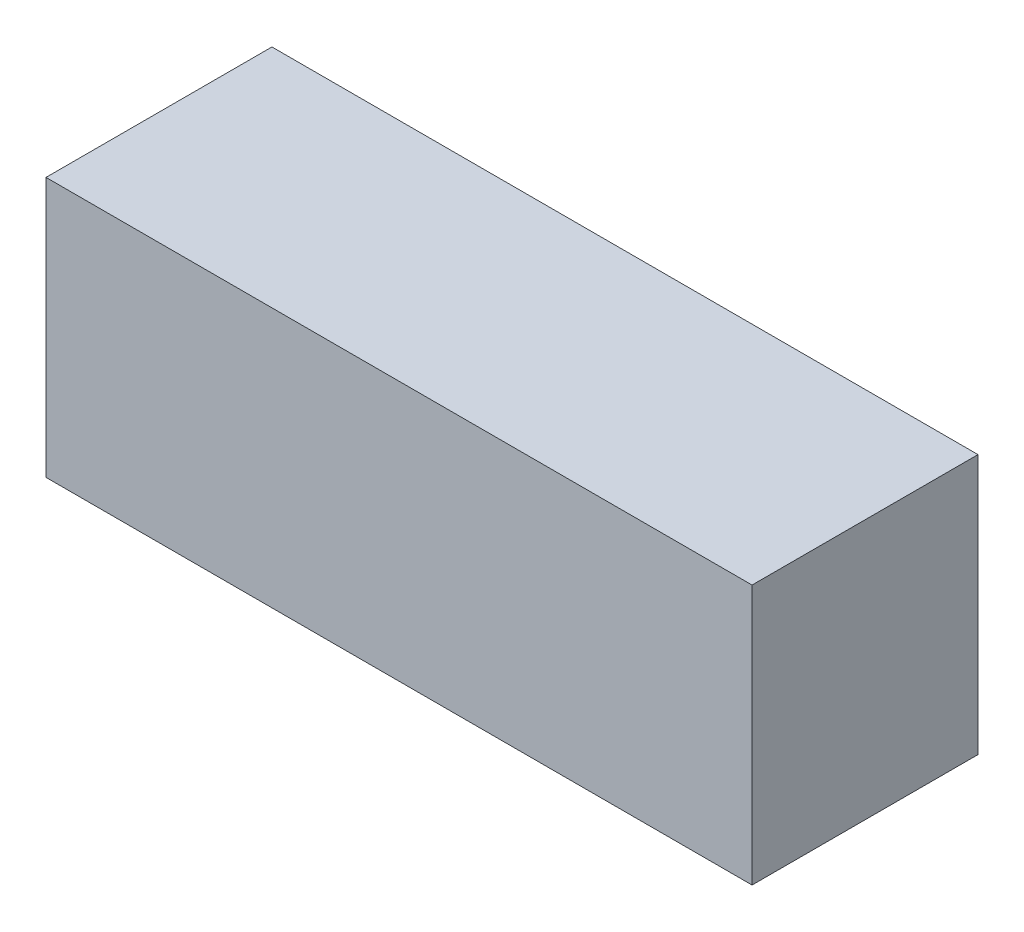
ISO-10303-21;
HEADER;
FILE_DESCRIPTION(('STEP AP214'),'2;1');
FILE_NAME('part.step','',(''),(''),'','','');
FILE_SCHEMA(('AUTOMOTIVE_DESIGN { 1 0 10303 214 1 1 1 1 }'));
ENDSEC;
DATA;
#1=APPLICATION_CONTEXT('core data for automotive mechanical design processes');
#2=APPLICATION_PROTOCOL_DEFINITION('international standard','automotive_design',2000,#1);
#3=PRODUCT_CONTEXT('',#1,'mechanical');
#4=PRODUCT('Part','Part','',(#3));
#5=PRODUCT_RELATED_PRODUCT_CATEGORY('part','',(#4));
#6=PRODUCT_DEFINITION_FORMATION('','',#4);
#7=PRODUCT_DEFINITION_CONTEXT('part definition',#1,'design');
#8=PRODUCT_DEFINITION('design','',#6,#7);
#9=PRODUCT_DEFINITION_SHAPE('','',#8);
#10=(LENGTH_UNIT() NAMED_UNIT(*) SI_UNIT(.MILLI.,.METRE.));
#11=(NAMED_UNIT(*) PLANE_ANGLE_UNIT() SI_UNIT($,.RADIAN.));
#12=(NAMED_UNIT(*) SI_UNIT($,.STERADIAN.) SOLID_ANGLE_UNIT());
#13=UNCERTAINTY_MEASURE_WITH_UNIT(LENGTH_MEASURE(1.E-05),#10,'distance_accuracy_value','');
#14=(GEOMETRIC_REPRESENTATION_CONTEXT(3) GLOBAL_UNCERTAINTY_ASSIGNED_CONTEXT((#13)) GLOBAL_UNIT_ASSIGNED_CONTEXT((#10,
#11,#12)) REPRESENTATION_CONTEXT('',''));
#15=CARTESIAN_POINT('',(0.,0.,0.));
#16=DIRECTION('',(0.,0.,1.));
#17=DIRECTION('',(1.,0.,0.));
#18=AXIS2_PLACEMENT_3D('',#15,#16,#17);
#19=CARTESIAN_POINT('',(-103.860792912636,-3.99999999999998,-4.));
#20=DIRECTION('',(-1.,0.,0.));
#21=DIRECTION('',(0.,0.,1.));
#22=AXIS2_PLACEMENT_3D('',#19,#20,#21);
#23=PLANE('',#22);
#24=DIRECTION('',(0.,-1.,0.));
#25=VECTOR('',#24,1.);
#26=CARTESIAN_POINT('',(-103.860792912636,-3.99999999999998,0.));
#27=LINE('',#26,#25);
#28=CARTESIAN_POINT('',(-103.860792912636,-3.99999999999998,0.));
#29=VERTEX_POINT('',#28);
#30=CARTESIAN_POINT('',(-103.860792912636,-8.59999999999998,0.));
#31=VERTEX_POINT('',#30);
#32=EDGE_CURVE('E97',#29,#31,#27,.T.);
#33=ORIENTED_EDGE('',*,*,#32,.F.);
#34=DIRECTION('',(0.,0.,1.));
#35=VECTOR('',#34,1.);
#36=CARTESIAN_POINT('',(-103.860792912636,-3.99999999999998,-4.));
#37=LINE('',#36,#35);
#38=CARTESIAN_POINT('',(-103.860792912636,-3.99999999999998,-4.));
#39=VERTEX_POINT('',#38);
#40=EDGE_CURVE('E11',#39,#29,#37,.T.);
#41=ORIENTED_EDGE('',*,*,#40,.F.);
#42=DIRECTION('',(0.,-1.,0.));
#43=VECTOR('',#42,1.);
#44=CARTESIAN_POINT('',(-103.860792912636,-3.99999999999998,-4.));
#45=LINE('',#44,#43);
#46=CARTESIAN_POINT('',(-103.860792912636,-8.59999999999998,-4.));
#47=VERTEX_POINT('',#46);
#48=EDGE_CURVE('E91',#39,#47,#45,.T.);
#49=ORIENTED_EDGE('',*,*,#48,.T.);
#50=DIRECTION('',(0.,0.,1.));
#51=VECTOR('',#50,1.);
#52=CARTESIAN_POINT('',(-103.860792912636,-8.59999999999998,-4.));
#53=LINE('',#52,#51);
#54=EDGE_CURVE('E36',#47,#31,#53,.T.);
#55=ORIENTED_EDGE('',*,*,#54,.T.);
#56=EDGE_LOOP('',(#33,#41,#49,#55));
#57=FACE_BOUND('',#56,.T.);
#58=ADVANCED_FACE('F33',(#57),#23,.T.);
#59=CARTESIAN_POINT('',(-103.860792912636,-3.99999999999998,-4.));
#60=DIRECTION('',(0.,1.,0.));
#61=DIRECTION('',(0.,0.,1.));
#62=AXIS2_PLACEMENT_3D('',#59,#60,#61);
#63=PLANE('',#62);
#64=DIRECTION('',(-1.,0.,0.));
#65=VECTOR('',#64,1.);
#66=CARTESIAN_POINT('',(-103.860792912636,-3.99999999999998,0.));
#67=LINE('',#66,#65);
#68=CARTESIAN_POINT('',(-91.3607929126358,-3.99999999999998,0.));
#69=VERTEX_POINT('',#68);
#70=EDGE_CURVE('E93',#69,#29,#67,.T.);
#71=ORIENTED_EDGE('',*,*,#70,.F.);
#72=DIRECTION('',(0.,0.,1.));
#73=VECTOR('',#72,1.);
#74=CARTESIAN_POINT('',(-91.3607929126358,-3.99999999999998,-4.));
#75=LINE('',#74,#73);
#76=CARTESIAN_POINT('',(-91.3607929126358,-3.99999999999998,-4.));
#77=VERTEX_POINT('',#76);
#78=EDGE_CURVE('E42',#77,#69,#75,.T.);
#79=ORIENTED_EDGE('',*,*,#78,.F.);
#80=DIRECTION('',(-1.,0.,0.));
#81=VECTOR('',#80,1.);
#82=CARTESIAN_POINT('',(-103.860792912636,-3.99999999999998,-4.));
#83=LINE('',#82,#81);
#84=EDGE_CURVE('E88',#77,#39,#83,.T.);
#85=ORIENTED_EDGE('',*,*,#84,.T.);
#86=ORIENTED_EDGE('',*,*,#40,.T.);
#87=EDGE_LOOP('',(#71,#79,#85,#86));
#88=FACE_BOUND('',#87,.T.);
#89=ADVANCED_FACE('F107',(#88),#63,.T.);
#90=CARTESIAN_POINT('',(-91.3607929126358,-3.99999999999998,-4.));
#91=DIRECTION('',(1.,0.,0.));
#92=DIRECTION('',(0.,0.,-1.));
#93=AXIS2_PLACEMENT_3D('',#90,#91,#92);
#94=PLANE('',#93);
#95=DIRECTION('',(0.,1.,0.));
#96=VECTOR('',#95,1.);
#97=CARTESIAN_POINT('',(-91.3607929126358,-3.99999999999998,0.));
#98=LINE('',#97,#96);
#99=CARTESIAN_POINT('',(-91.3607929126358,-8.59999999999998,0.));
#100=VERTEX_POINT('',#99);
#101=EDGE_CURVE('E83',#100,#69,#98,.T.);
#102=ORIENTED_EDGE('',*,*,#101,.F.);
#103=DIRECTION('',(0.,0.,1.));
#104=VECTOR('',#103,1.);
#105=CARTESIAN_POINT('',(-91.3607929126358,-8.59999999999998,-4.));
#106=LINE('',#105,#104);
#107=CARTESIAN_POINT('',(-91.3607929126358,-8.59999999999998,-4.));
#108=VERTEX_POINT('',#107);
#109=EDGE_CURVE('E78',#108,#100,#106,.T.);
#110=ORIENTED_EDGE('',*,*,#109,.F.);
#111=DIRECTION('',(0.,1.,0.));
#112=VECTOR('',#111,1.);
#113=CARTESIAN_POINT('',(-91.3607929126358,-3.99999999999998,-4.));
#114=LINE('',#113,#112);
#115=EDGE_CURVE('E81',#108,#77,#114,.T.);
#116=ORIENTED_EDGE('',*,*,#115,.T.);
#117=ORIENTED_EDGE('',*,*,#78,.T.);
#118=EDGE_LOOP('',(#102,#110,#116,#117));
#119=FACE_BOUND('',#118,.T.);
#120=ADVANCED_FACE('F80',(#119),#94,.T.);
#121=CARTESIAN_POINT('',(-103.860792912636,-8.59999999999998,-4.));
#122=DIRECTION('',(0.,-1.,0.));
#123=DIRECTION('',(0.,0.,-1.));
#124=AXIS2_PLACEMENT_3D('',#121,#122,#123);
#125=PLANE('',#124);
#126=DIRECTION('',(1.,0.,0.));
#127=VECTOR('',#126,1.);
#128=CARTESIAN_POINT('',(-103.860792912636,-8.59999999999998,0.));
#129=LINE('',#128,#127);
#130=EDGE_CURVE('E100',#31,#100,#129,.T.);
#131=ORIENTED_EDGE('',*,*,#130,.F.);
#132=ORIENTED_EDGE('',*,*,#54,.F.);
#133=DIRECTION('',(1.,0.,0.));
#134=VECTOR('',#133,1.);
#135=CARTESIAN_POINT('',(-103.860792912636,-8.59999999999998,-4.));
#136=LINE('',#135,#134);
#137=EDGE_CURVE('E87',#47,#108,#136,.T.);
#138=ORIENTED_EDGE('',*,*,#137,.T.);
#139=ORIENTED_EDGE('',*,*,#109,.T.);
#140=EDGE_LOOP('',(#131,#132,#138,#139));
#141=FACE_BOUND('',#140,.T.);
#142=ADVANCED_FACE('F90',(#141),#125,.T.);
#143=CARTESIAN_POINT('',(0.,0.,-4.));
#144=DIRECTION('',(0.,0.,1.));
#145=DIRECTION('',(1.,0.,0.));
#146=AXIS2_PLACEMENT_3D('',#143,#144,#145);
#147=PLANE('',#146);
#148=ORIENTED_EDGE('',*,*,#48,.F.);
#149=ORIENTED_EDGE('',*,*,#84,.F.);
#150=ORIENTED_EDGE('',*,*,#115,.F.);
#151=ORIENTED_EDGE('',*,*,#137,.F.);
#152=EDGE_LOOP('',(#148,#149,#150,#151));
#153=FACE_BOUND('',#152,.T.);
#154=ADVANCED_FACE('F86',(#153),#147,.F.);
#155=CARTESIAN_POINT('',(0.,0.,0.));
#156=DIRECTION('',(0.,0.,1.));
#157=DIRECTION('',(1.,0.,0.));
#158=AXIS2_PLACEMENT_3D('',#155,#156,#157);
#159=PLANE('',#158);
#160=ORIENTED_EDGE('',*,*,#32,.T.);
#161=ORIENTED_EDGE('',*,*,#130,.T.);
#162=ORIENTED_EDGE('',*,*,#101,.T.);
#163=ORIENTED_EDGE('',*,*,#70,.T.);
#164=EDGE_LOOP('',(#160,#161,#162,#163));
#165=FACE_BOUND('',#164,.T.);
#166=ADVANCED_FACE('F106',(#165),#159,.T.);
#167=CLOSED_SHELL('',(#58,#89,#120,#142,#154,#166));
#168=MANIFOLD_SOLID_BREP('B2',#167);
#169=ADVANCED_BREP_SHAPE_REPRESENTATION('',(#18,#168),#14);
#170=SHAPE_DEFINITION_REPRESENTATION(#9,#169);
ENDSEC;
END-ISO-10303-21;
